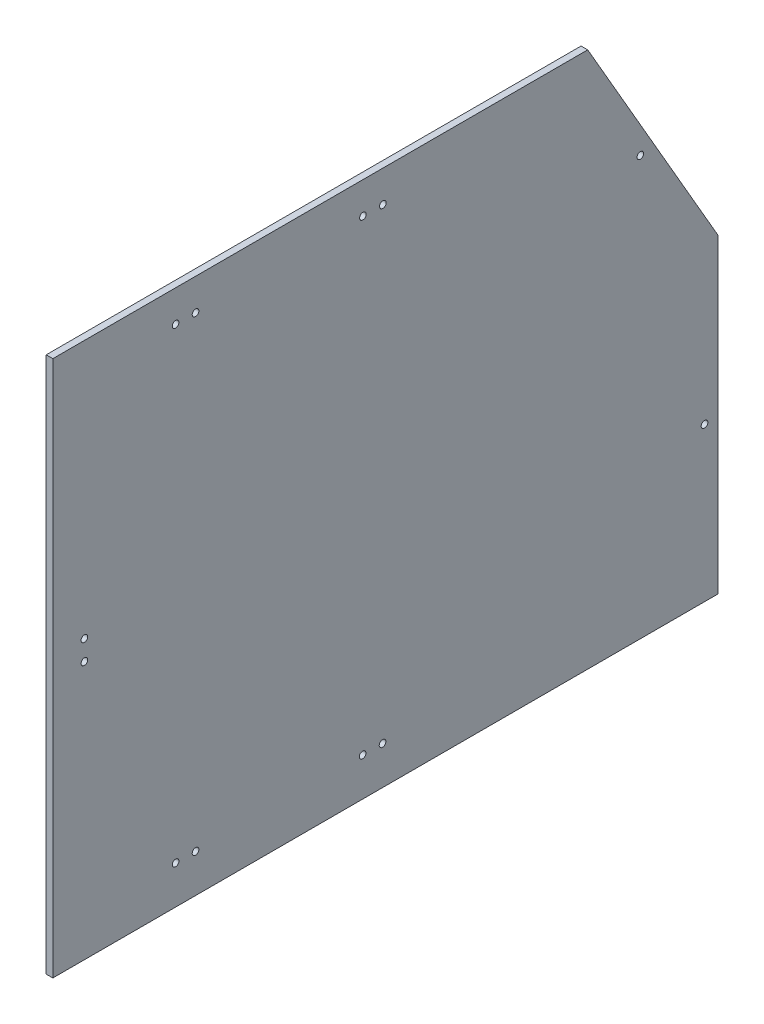
ISO-10303-21;
HEADER;
FILE_DESCRIPTION(('STEP AP214'),'2;1');
FILE_NAME('part.step','',(''),(''),'','','');
FILE_SCHEMA(('AUTOMOTIVE_DESIGN { 1 0 10303 214 1 1 1 1 }'));
ENDSEC;
DATA;
#1=APPLICATION_CONTEXT('core data for automotive mechanical design processes');
#2=APPLICATION_PROTOCOL_DEFINITION('international standard','automotive_design',2000,#1);
#3=PRODUCT_CONTEXT('',#1,'mechanical');
#4=PRODUCT('Part','Part','',(#3));
#5=PRODUCT_RELATED_PRODUCT_CATEGORY('part','',(#4));
#6=PRODUCT_DEFINITION_FORMATION('','',#4);
#7=PRODUCT_DEFINITION_CONTEXT('part definition',#1,'design');
#8=PRODUCT_DEFINITION('design','',#6,#7);
#9=PRODUCT_DEFINITION_SHAPE('','',#8);
#10=(LENGTH_UNIT() NAMED_UNIT(*) SI_UNIT(.MILLI.,.METRE.));
#11=(NAMED_UNIT(*) PLANE_ANGLE_UNIT() SI_UNIT($,.RADIAN.));
#12=(NAMED_UNIT(*) SI_UNIT($,.STERADIAN.) SOLID_ANGLE_UNIT());
#13=UNCERTAINTY_MEASURE_WITH_UNIT(LENGTH_MEASURE(1.E-05),#10,'distance_accuracy_value','');
#14=(GEOMETRIC_REPRESENTATION_CONTEXT(3) GLOBAL_UNCERTAINTY_ASSIGNED_CONTEXT((#13)) GLOBAL_UNIT_ASSIGNED_CONTEXT((#10,
#11,#12)) REPRESENTATION_CONTEXT('',''));
#15=CARTESIAN_POINT('',(0.,0.,0.));
#16=DIRECTION('',(0.,0.,1.));
#17=DIRECTION('',(1.,0.,0.));
#18=AXIS2_PLACEMENT_3D('',#15,#16,#17);
#19=CARTESIAN_POINT('',(3.,0.,0.));
#20=DIRECTION('',(1.,0.,0.));
#21=DIRECTION('',(0.,0.,-1.));
#22=AXIS2_PLACEMENT_3D('',#19,#20,#21);
#23=PLANE('',#22);
#24=CARTESIAN_POINT('',(3.,-59.4436564944908,-80.7515923566879));
#25=DIRECTION('',(1.,0.,0.));
#26=DIRECTION('',(0.,0.,-1.));
#27=AXIS2_PLACEMENT_3D('',#24,#25,#26);
#28=CIRCLE('',#27,1.49999999999994);
#29=CARTESIAN_POINT('',(3.,-59.4436564944908,-82.2515923566879));
#30=VERTEX_POINT('',#29);
#31=EDGE_CURVE('E184',#30,#30,#28,.T.);
#32=ORIENTED_EDGE('',*,*,#31,.F.);
#33=EDGE_LOOP('',(#32));
#34=FACE_BOUND('',#33,.T.);
#35=CARTESIAN_POINT('',(3.,60.0413435055093,-51.8039152110818));
#36=DIRECTION('',(1.,0.,0.));
#37=DIRECTION('',(0.,0.,-1.));
#38=AXIS2_PLACEMENT_3D('',#35,#36,#37);
#39=CIRCLE('',#38,1.49999999999994);
#40=CARTESIAN_POINT('',(3.,60.0413435055093,-53.3039152110817));
#41=VERTEX_POINT('',#40);
#42=EDGE_CURVE('E192',#41,#41,#39,.T.);
#43=ORIENTED_EDGE('',*,*,#42,.F.);
#44=EDGE_LOOP('',(#43));
#45=FACE_BOUND('',#44,.T.);
#46=CARTESIAN_POINT('',(3.,-3.30480891719709,198.995456466428));
#47=DIRECTION('',(1.,0.,0.));
#48=DIRECTION('',(0.,0.,-1.));
#49=AXIS2_PLACEMENT_3D('',#46,#47,#48);
#50=CIRCLE('',#49,1.49999999999994);
#51=CARTESIAN_POINT('',(3.,-3.30480891719709,197.495456466428));
#52=VERTEX_POINT('',#51);
#53=EDGE_CURVE('E203',#52,#52,#50,.T.);
#54=ORIENTED_EDGE('',*,*,#53,.F.);
#55=EDGE_LOOP('',(#54));
#56=FACE_BOUND('',#55,.T.);
#57=CARTESIAN_POINT('',(3.,98.9272399059343,157.867084277006));
#58=DIRECTION('',(1.,0.,0.));
#59=DIRECTION('',(0.,0.,-1.));
#60=AXIS2_PLACEMENT_3D('',#57,#58,#59);
#61=CIRCLE('',#60,1.49999999999997);
#62=CARTESIAN_POINT('',(3.,98.9272399059343,156.367084277006));
#63=VERTEX_POINT('',#62);
#64=EDGE_CURVE('E213',#63,#63,#61,.T.);
#65=ORIENTED_EDGE('',*,*,#64,.F.);
#66=EDGE_LOOP('',(#65));
#67=FACE_BOUND('',#66,.T.);
#68=CARTESIAN_POINT('',(3.,98.9272399059346,148.867084277006));
#69=DIRECTION('',(1.,0.,0.));
#70=DIRECTION('',(0.,0.,-1.));
#71=AXIS2_PLACEMENT_3D('',#68,#69,#70);
#72=CIRCLE('',#71,1.50000000000009);
#73=CARTESIAN_POINT('',(3.,98.9272399059346,147.367084277006));
#74=VERTEX_POINT('',#73);
#75=EDGE_CURVE('E209',#74,#74,#72,.T.);
#76=ORIENTED_EDGE('',*,*,#75,.F.);
#77=EDGE_LOOP('',(#76));
#78=FACE_BOUND('',#77,.T.);
#79=CARTESIAN_POINT('',(3.,98.9272399059301,73.3548674119187));
#80=DIRECTION('',(1.,0.,0.));
#81=DIRECTION('',(0.,0.,-1.));
#82=AXIS2_PLACEMENT_3D('',#79,#80,#81);
#83=CIRCLE('',#82,1.49999999999995);
#84=CARTESIAN_POINT('',(3.,98.9272399059301,71.8548674119187));
#85=VERTEX_POINT('',#84);
#86=EDGE_CURVE('E204',#85,#85,#83,.T.);
#87=ORIENTED_EDGE('',*,*,#86,.F.);
#88=EDGE_LOOP('',(#87));
#89=FACE_BOUND('',#88,.T.);
#90=CARTESIAN_POINT('',(3.,98.9272399059301,64.3548674119187));
#91=DIRECTION('',(1.,0.,0.));
#92=DIRECTION('',(0.,0.,-1.));
#93=AXIS2_PLACEMENT_3D('',#90,#91,#92);
#94=CIRCLE('',#93,1.49999999999995);
#95=CARTESIAN_POINT('',(3.,98.9272399059301,62.8548674119187));
#96=VERTEX_POINT('',#95);
#97=EDGE_CURVE('E208',#96,#96,#94,.T.);
#98=ORIENTED_EDGE('',*,*,#97,.F.);
#99=EDGE_LOOP('',(#98));
#100=FACE_BOUND('',#99,.T.);
#101=CARTESIAN_POINT('',(3.,-111.536857740313,148.867084277005));
#102=DIRECTION('',(1.,0.,0.));
#103=DIRECTION('',(0.,0.,-1.));
#104=AXIS2_PLACEMENT_3D('',#101,#102,#103);
#105=CIRCLE('',#104,1.49999999999997);
#106=CARTESIAN_POINT('',(3.,-111.536857740313,147.367084277005));
#107=VERTEX_POINT('',#106);
#108=EDGE_CURVE('E220',#107,#107,#105,.F.);
#109=ORIENTED_EDGE('',*,*,#108,.T.);
#110=EDGE_LOOP('',(#109));
#111=FACE_BOUND('',#110,.T.);
#112=DIRECTION('',(0.,0.,1.));
#113=VECTOR('',#112,1.);
#114=CARTESIAN_POINT('',(3.,113.180191082803,-28.0523904881823));
#115=LINE('',#114,#113);
#116=CARTESIAN_POINT('',(3.,113.180191082803,-28.0523904881823));
#117=VERTEX_POINT('',#116);
#118=CARTESIAN_POINT('',(3.,113.180191082803,213.248407643312));
#119=VERTEX_POINT('',#118);
#120=EDGE_CURVE('E135',#117,#119,#115,.T.);
#121=ORIENTED_EDGE('',*,*,#120,.T.);
#122=DIRECTION('',(0.,-1.,0.));
#123=VECTOR('',#122,1.);
#124=CARTESIAN_POINT('',(3.,113.180191082803,213.248407643312));
#125=LINE('',#124,#123);
#126=CARTESIAN_POINT('',(3.,-128.789808917197,213.248407643312));
#127=VERTEX_POINT('',#126);
#128=EDGE_CURVE('E93',#119,#127,#125,.T.);
#129=ORIENTED_EDGE('',*,*,#128,.T.);
#130=DIRECTION('',(0.,0.,-1.));
#131=VECTOR('',#130,1.);
#132=CARTESIAN_POINT('',(3.,-128.789808917197,213.248407643312));
#133=LINE('',#132,#131);
#134=CARTESIAN_POINT('',(3.,-128.789808917197,-86.751592356688));
#135=VERTEX_POINT('',#134);
#136=EDGE_CURVE('E97',#127,#135,#133,.T.);
#137=ORIENTED_EDGE('',*,*,#136,.T.);
#138=DIRECTION('',(0.,1.,0.));
#139=VECTOR('',#138,1.);
#140=CARTESIAN_POINT('',(3.,-128.789808917197,-86.751592356688));
#141=LINE('',#140,#139);
#142=CARTESIAN_POINT('',(3.,11.5101910828025,-86.751592356688));
#143=VERTEX_POINT('',#142);
#144=EDGE_CURVE('E101',#135,#143,#141,.T.);
#145=ORIENTED_EDGE('',*,*,#144,.T.);
#146=DIRECTION('',(0.,0.866025403784452,0.499999999999977));
#147=VECTOR('',#146,1.);
#148=CARTESIAN_POINT('',(3.,11.5101910828025,-86.751592356688));
#149=LINE('',#148,#147);
#150=EDGE_CURVE('E59',#143,#117,#149,.T.);
#151=ORIENTED_EDGE('',*,*,#150,.T.);
#152=EDGE_LOOP('',(#121,#129,#137,#145,#151));
#153=FACE_BOUND('',#152,.T.);
#154=CARTESIAN_POINT('',(3.,-111.536857740313,157.867084277005));
#155=DIRECTION('',(1.,0.,0.));
#156=DIRECTION('',(0.,0.,-1.));
#157=AXIS2_PLACEMENT_3D('',#154,#155,#156);
#158=CIRCLE('',#157,1.49999999999997);
#159=CARTESIAN_POINT('',(3.,-111.536857740313,156.367084277005));
#160=VERTEX_POINT('',#159);
#161=EDGE_CURVE('E147',#160,#160,#158,.T.);
#162=ORIENTED_EDGE('',*,*,#161,.F.);
#163=EDGE_LOOP('',(#162));
#164=FACE_BOUND('',#163,.T.);
#165=CARTESIAN_POINT('',(3.,-12.3048089171972,198.995456466428));
#166=DIRECTION('',(1.,0.,0.));
#167=DIRECTION('',(0.,0.,-1.));
#168=AXIS2_PLACEMENT_3D('',#165,#166,#167);
#169=CIRCLE('',#168,1.49999999999994);
#170=CARTESIAN_POINT('',(3.,-12.3048089171972,197.495456466428));
#171=VERTEX_POINT('',#170);
#172=EDGE_CURVE('E190',#171,#171,#169,.F.);
#173=ORIENTED_EDGE('',*,*,#172,.T.);
#174=EDGE_LOOP('',(#173));
#175=FACE_BOUND('',#174,.T.);
#176=CARTESIAN_POINT('',(3.,-111.536857740313,73.5022075014292));
#177=DIRECTION('',(1.,0.,0.));
#178=DIRECTION('',(0.,0.,-1.));
#179=AXIS2_PLACEMENT_3D('',#176,#177,#178);
#180=CIRCLE('',#179,1.49999999999997);
#181=CARTESIAN_POINT('',(3.,-111.536857740313,72.0022075014292));
#182=VERTEX_POINT('',#181);
#183=EDGE_CURVE('E224',#182,#182,#180,.T.);
#184=ORIENTED_EDGE('',*,*,#183,.F.);
#185=EDGE_LOOP('',(#184));
#186=FACE_BOUND('',#185,.T.);
#187=CARTESIAN_POINT('',(3.,-111.536857740313,64.502207501429));
#188=DIRECTION('',(1.,0.,0.));
#189=DIRECTION('',(0.,0.,-1.));
#190=AXIS2_PLACEMENT_3D('',#187,#188,#189);
#191=CIRCLE('',#190,1.49999999999997);
#192=CARTESIAN_POINT('',(3.,-111.536857740313,63.0022075014291));
#193=VERTEX_POINT('',#192);
#194=EDGE_CURVE('E228',#193,#193,#191,.F.);
#195=ORIENTED_EDGE('',*,*,#194,.T.);
#196=EDGE_LOOP('',(#195));
#197=FACE_BOUND('',#196,.T.);
#198=ADVANCED_FACE('F39',(#34,#45,#56,#67,#78,#89,#100,#111,#153,#164,#175,#186,#197),#23,.T.);
#199=CARTESIAN_POINT('',(0.,0.,0.));
#200=DIRECTION('',(1.,0.,0.));
#201=DIRECTION('',(0.,0.,-1.));
#202=AXIS2_PLACEMENT_3D('',#199,#200,#201);
#203=PLANE('',#202);
#204=CARTESIAN_POINT('',(0.,-59.4436564944908,-80.7515923566879));
#205=DIRECTION('',(1.,0.,0.));
#206=DIRECTION('',(0.,0.,-1.));
#207=AXIS2_PLACEMENT_3D('',#204,#205,#206);
#208=CIRCLE('',#207,1.49999999999994);
#209=CARTESIAN_POINT('',(0.,-59.4436564944908,-82.2515923566879));
#210=VERTEX_POINT('',#209);
#211=EDGE_CURVE('E43',#210,#210,#208,.T.);
#212=ORIENTED_EDGE('',*,*,#211,.T.);
#213=EDGE_LOOP('',(#212));
#214=FACE_BOUND('',#213,.T.);
#215=CARTESIAN_POINT('',(0.,60.0413435055093,-51.8039152110818));
#216=DIRECTION('',(1.,0.,0.));
#217=DIRECTION('',(0.,0.,-1.));
#218=AXIS2_PLACEMENT_3D('',#215,#216,#217);
#219=CIRCLE('',#218,1.49999999999994);
#220=CARTESIAN_POINT('',(0.,60.0413435055093,-53.3039152110817));
#221=VERTEX_POINT('',#220);
#222=EDGE_CURVE('E181',#221,#221,#219,.T.);
#223=ORIENTED_EDGE('',*,*,#222,.T.);
#224=EDGE_LOOP('',(#223));
#225=FACE_BOUND('',#224,.T.);
#226=CARTESIAN_POINT('',(0.,-3.30480891719709,198.995456466428));
#227=DIRECTION('',(1.,0.,0.));
#228=DIRECTION('',(0.,0.,-1.));
#229=AXIS2_PLACEMENT_3D('',#226,#227,#228);
#230=CIRCLE('',#229,1.49999999999994);
#231=CARTESIAN_POINT('',(0.,-3.30480891719709,197.495456466428));
#232=VERTEX_POINT('',#231);
#233=EDGE_CURVE('E126',#232,#232,#230,.T.);
#234=ORIENTED_EDGE('',*,*,#233,.T.);
#235=EDGE_LOOP('',(#234));
#236=FACE_BOUND('',#235,.T.);
#237=CARTESIAN_POINT('',(0.,98.9272399059343,157.867084277006));
#238=DIRECTION('',(1.,0.,0.));
#239=DIRECTION('',(0.,0.,-1.));
#240=AXIS2_PLACEMENT_3D('',#237,#238,#239);
#241=CIRCLE('',#240,1.49999999999997);
#242=CARTESIAN_POINT('',(0.,98.9272399059343,156.367084277006));
#243=VERTEX_POINT('',#242);
#244=EDGE_CURVE('E175',#243,#243,#241,.T.);
#245=ORIENTED_EDGE('',*,*,#244,.T.);
#246=EDGE_LOOP('',(#245));
#247=FACE_BOUND('',#246,.T.);
#248=CARTESIAN_POINT('',(0.,98.9272399059346,148.867084277006));
#249=DIRECTION('',(1.,0.,0.));
#250=DIRECTION('',(0.,0.,-1.));
#251=AXIS2_PLACEMENT_3D('',#248,#249,#250);
#252=CIRCLE('',#251,1.50000000000009);
#253=CARTESIAN_POINT('',(0.,98.9272399059346,147.367084277006));
#254=VERTEX_POINT('',#253);
#255=EDGE_CURVE('E171',#254,#254,#252,.T.);
#256=ORIENTED_EDGE('',*,*,#255,.T.);
#257=EDGE_LOOP('',(#256));
#258=FACE_BOUND('',#257,.T.);
#259=CARTESIAN_POINT('',(0.,98.9272399059301,73.3548674119187));
#260=DIRECTION('',(1.,0.,0.));
#261=DIRECTION('',(0.,0.,-1.));
#262=AXIS2_PLACEMENT_3D('',#259,#260,#261);
#263=CIRCLE('',#262,1.49999999999995);
#264=CARTESIAN_POINT('',(0.,98.9272399059301,71.8548674119187));
#265=VERTEX_POINT('',#264);
#266=EDGE_CURVE('E167',#265,#265,#263,.T.);
#267=ORIENTED_EDGE('',*,*,#266,.T.);
#268=EDGE_LOOP('',(#267));
#269=FACE_BOUND('',#268,.T.);
#270=CARTESIAN_POINT('',(0.,98.9272399059301,64.3548674119187));
#271=DIRECTION('',(1.,0.,0.));
#272=DIRECTION('',(0.,0.,-1.));
#273=AXIS2_PLACEMENT_3D('',#270,#271,#272);
#274=CIRCLE('',#273,1.49999999999995);
#275=CARTESIAN_POINT('',(0.,98.9272399059301,62.8548674119187));
#276=VERTEX_POINT('',#275);
#277=EDGE_CURVE('E163',#276,#276,#274,.T.);
#278=ORIENTED_EDGE('',*,*,#277,.T.);
#279=EDGE_LOOP('',(#278));
#280=FACE_BOUND('',#279,.T.);
#281=CARTESIAN_POINT('',(0.,-111.536857740313,73.5022075014292));
#282=DIRECTION('',(1.,0.,0.));
#283=DIRECTION('',(0.,0.,-1.));
#284=AXIS2_PLACEMENT_3D('',#281,#282,#283);
#285=CIRCLE('',#284,1.49999999999997);
#286=CARTESIAN_POINT('',(0.,-111.536857740313,72.0022075014292));
#287=VERTEX_POINT('',#286);
#288=EDGE_CURVE('E155',#287,#287,#285,.T.);
#289=ORIENTED_EDGE('',*,*,#288,.T.);
#290=EDGE_LOOP('',(#289));
#291=FACE_BOUND('',#290,.T.);
#292=CARTESIAN_POINT('',(0.,-111.536857740313,157.867084277005));
#293=DIRECTION('',(1.,0.,0.));
#294=DIRECTION('',(0.,0.,-1.));
#295=AXIS2_PLACEMENT_3D('',#292,#293,#294);
#296=CIRCLE('',#295,1.49999999999997);
#297=CARTESIAN_POINT('',(0.,-111.536857740313,156.367084277005));
#298=VERTEX_POINT('',#297);
#299=EDGE_CURVE('E142',#298,#298,#296,.T.);
#300=ORIENTED_EDGE('',*,*,#299,.T.);
#301=EDGE_LOOP('',(#300));
#302=FACE_BOUND('',#301,.T.);
#303=DIRECTION('',(0.,0.,1.));
#304=VECTOR('',#303,1.);
#305=CARTESIAN_POINT('',(0.,113.180191082803,-28.0523904881823));
#306=LINE('',#305,#304);
#307=CARTESIAN_POINT('',(0.,113.180191082803,-28.0523904881823));
#308=VERTEX_POINT('',#307);
#309=CARTESIAN_POINT('',(0.,113.180191082803,213.248407643312));
#310=VERTEX_POINT('',#309);
#311=EDGE_CURVE('E121',#308,#310,#306,.T.);
#312=ORIENTED_EDGE('',*,*,#311,.F.);
#313=DIRECTION('',(0.,0.866025403784452,0.499999999999977));
#314=VECTOR('',#313,1.);
#315=CARTESIAN_POINT('',(0.,11.5101910828025,-86.751592356688));
#316=LINE('',#315,#314);
#317=CARTESIAN_POINT('',(0.,11.5101910828025,-86.751592356688));
#318=VERTEX_POINT('',#317);
#319=EDGE_CURVE('E85',#318,#308,#316,.T.);
#320=ORIENTED_EDGE('',*,*,#319,.F.);
#321=DIRECTION('',(0.,1.,0.));
#322=VECTOR('',#321,1.);
#323=CARTESIAN_POINT('',(0.,-128.789808917197,-86.751592356688));
#324=LINE('',#323,#322);
#325=CARTESIAN_POINT('',(0.,-128.789808917197,-86.751592356688));
#326=VERTEX_POINT('',#325);
#327=EDGE_CURVE('E79',#326,#318,#324,.T.);
#328=ORIENTED_EDGE('',*,*,#327,.F.);
#329=DIRECTION('',(0.,0.,-1.));
#330=VECTOR('',#329,1.);
#331=CARTESIAN_POINT('',(0.,-128.789808917197,213.248407643312));
#332=LINE('',#331,#330);
#333=CARTESIAN_POINT('',(0.,-128.789808917197,213.248407643312));
#334=VERTEX_POINT('',#333);
#335=EDGE_CURVE('E109',#334,#326,#332,.T.);
#336=ORIENTED_EDGE('',*,*,#335,.F.);
#337=DIRECTION('',(0.,-1.,0.));
#338=VECTOR('',#337,1.);
#339=CARTESIAN_POINT('',(0.,113.180191082803,213.248407643312));
#340=LINE('',#339,#338);
#341=EDGE_CURVE('E125',#310,#334,#340,.T.);
#342=ORIENTED_EDGE('',*,*,#341,.F.);
#343=EDGE_LOOP('',(#312,#320,#328,#336,#342));
#344=FACE_BOUND('',#343,.T.);
#345=CARTESIAN_POINT('',(0.,-12.3048089171972,198.995456466428));
#346=DIRECTION('',(1.,0.,0.));
#347=DIRECTION('',(0.,0.,-1.));
#348=AXIS2_PLACEMENT_3D('',#345,#346,#347);
#349=CIRCLE('',#348,1.49999999999994);
#350=CARTESIAN_POINT('',(0.,-12.3048089171972,197.495456466428));
#351=VERTEX_POINT('',#350);
#352=EDGE_CURVE('E146',#351,#351,#349,.F.);
#353=ORIENTED_EDGE('',*,*,#352,.F.);
#354=EDGE_LOOP('',(#353));
#355=FACE_BOUND('',#354,.T.);
#356=CARTESIAN_POINT('',(0.,-111.536857740313,148.867084277005));
#357=DIRECTION('',(1.,0.,0.));
#358=DIRECTION('',(0.,0.,-1.));
#359=AXIS2_PLACEMENT_3D('',#356,#357,#358);
#360=CIRCLE('',#359,1.49999999999997);
#361=CARTESIAN_POINT('',(0.,-111.536857740313,147.367084277005));
#362=VERTEX_POINT('',#361);
#363=EDGE_CURVE('E151',#362,#362,#360,.F.);
#364=ORIENTED_EDGE('',*,*,#363,.F.);
#365=EDGE_LOOP('',(#364));
#366=FACE_BOUND('',#365,.T.);
#367=CARTESIAN_POINT('',(0.,-111.536857740313,64.502207501429));
#368=DIRECTION('',(1.,0.,0.));
#369=DIRECTION('',(0.,0.,-1.));
#370=AXIS2_PLACEMENT_3D('',#367,#368,#369);
#371=CIRCLE('',#370,1.49999999999997);
#372=CARTESIAN_POINT('',(0.,-111.536857740313,63.0022075014291));
#373=VERTEX_POINT('',#372);
#374=EDGE_CURVE('E159',#373,#373,#371,.F.);
#375=ORIENTED_EDGE('',*,*,#374,.F.);
#376=EDGE_LOOP('',(#375));
#377=FACE_BOUND('',#376,.T.);
#378=ADVANCED_FACE('F246',(#214,#225,#236,#247,#258,#269,#280,#291,#302,#344,#355,#366,#377),
#203,.F.);
#379=CARTESIAN_POINT('',(3.,113.180191082803,-28.0523904881823));
#380=DIRECTION('',(0.,-1.,0.));
#381=DIRECTION('',(0.,0.,-1.));
#382=AXIS2_PLACEMENT_3D('',#379,#380,#381);
#383=PLANE('',#382);
#384=ORIENTED_EDGE('',*,*,#311,.T.);
#385=DIRECTION('',(-1.,0.,0.));
#386=VECTOR('',#385,1.);
#387=CARTESIAN_POINT('',(3.,113.180191082803,213.248407643312));
#388=LINE('',#387,#386);
#389=EDGE_CURVE('E11',#119,#310,#388,.T.);
#390=ORIENTED_EDGE('',*,*,#389,.F.);
#391=ORIENTED_EDGE('',*,*,#120,.F.);
#392=DIRECTION('',(-1.,0.,0.));
#393=VECTOR('',#392,1.);
#394=CARTESIAN_POINT('',(3.,113.180191082803,-28.0523904881823));
#395=LINE('',#394,#393);
#396=EDGE_CURVE('E117',#117,#308,#395,.T.);
#397=ORIENTED_EDGE('',*,*,#396,.T.);
#398=EDGE_LOOP('',(#384,#390,#391,#397));
#399=FACE_BOUND('',#398,.T.);
#400=ADVANCED_FACE('F41',(#399),#383,.F.);
#401=CARTESIAN_POINT('',(3.,113.180191082803,213.248407643312));
#402=DIRECTION('',(0.,0.,-1.));
#403=DIRECTION('',(-1.,0.,0.));
#404=AXIS2_PLACEMENT_3D('',#401,#402,#403);
#405=PLANE('',#404);
#406=ORIENTED_EDGE('',*,*,#341,.T.);
#407=DIRECTION('',(-1.,0.,0.));
#408=VECTOR('',#407,1.);
#409=CARTESIAN_POINT('',(3.,-128.789808917197,213.248407643312));
#410=LINE('',#409,#408);
#411=EDGE_CURVE('E50',#127,#334,#410,.T.);
#412=ORIENTED_EDGE('',*,*,#411,.F.);
#413=ORIENTED_EDGE('',*,*,#128,.F.);
#414=ORIENTED_EDGE('',*,*,#389,.T.);
#415=EDGE_LOOP('',(#406,#412,#413,#414));
#416=FACE_BOUND('',#415,.T.);
#417=ADVANCED_FACE('F244',(#416),#405,.F.);
#418=CARTESIAN_POINT('',(3.,-128.789808917197,213.248407643312));
#419=DIRECTION('',(0.,1.,0.));
#420=DIRECTION('',(0.,0.,1.));
#421=AXIS2_PLACEMENT_3D('',#418,#419,#420);
#422=PLANE('',#421);
#423=ORIENTED_EDGE('',*,*,#335,.T.);
#424=DIRECTION('',(-1.,0.,0.));
#425=VECTOR('',#424,1.);
#426=CARTESIAN_POINT('',(3.,-128.789808917197,-86.751592356688));
#427=LINE('',#426,#425);
#428=EDGE_CURVE('E106',#135,#326,#427,.T.);
#429=ORIENTED_EDGE('',*,*,#428,.F.);
#430=ORIENTED_EDGE('',*,*,#136,.F.);
#431=ORIENTED_EDGE('',*,*,#411,.T.);
#432=EDGE_LOOP('',(#423,#429,#430,#431));
#433=FACE_BOUND('',#432,.T.);
#434=ADVANCED_FACE('F107',(#433),#422,.F.);
#435=CARTESIAN_POINT('',(3.,-128.789808917197,-86.751592356688));
#436=DIRECTION('',(0.,0.,1.));
#437=DIRECTION('',(1.,0.,0.));
#438=AXIS2_PLACEMENT_3D('',#435,#436,#437);
#439=PLANE('',#438);
#440=ORIENTED_EDGE('',*,*,#327,.T.);
#441=DIRECTION('',(-1.,0.,0.));
#442=VECTOR('',#441,1.);
#443=CARTESIAN_POINT('',(3.,11.5101910828025,-86.751592356688));
#444=LINE('',#443,#442);
#445=EDGE_CURVE('E111',#143,#318,#444,.T.);
#446=ORIENTED_EDGE('',*,*,#445,.F.);
#447=ORIENTED_EDGE('',*,*,#144,.F.);
#448=ORIENTED_EDGE('',*,*,#428,.T.);
#449=EDGE_LOOP('',(#440,#446,#447,#448));
#450=FACE_BOUND('',#449,.T.);
#451=ADVANCED_FACE('F113',(#450),#439,.F.);
#452=CARTESIAN_POINT('',(3.,11.5101910828025,-86.751592356688));
#453=DIRECTION('',(0.,-0.499999999999977,0.866025403784452));
#454=DIRECTION('',(0.,-0.866025403784452,-0.499999999999977));
#455=AXIS2_PLACEMENT_3D('',#452,#453,#454);
#456=PLANE('',#455);
#457=ORIENTED_EDGE('',*,*,#319,.T.);
#458=ORIENTED_EDGE('',*,*,#396,.F.);
#459=ORIENTED_EDGE('',*,*,#150,.F.);
#460=ORIENTED_EDGE('',*,*,#445,.T.);
#461=EDGE_LOOP('',(#457,#458,#459,#460));
#462=FACE_BOUND('',#461,.T.);
#463=ADVANCED_FACE('F283',(#462),#456,.F.);
#464=CARTESIAN_POINT('',(-7.,-111.536857740313,157.867084277005));
#465=DIRECTION('',(1.,0.,0.));
#466=DIRECTION('',(0.,0.,-1.));
#467=AXIS2_PLACEMENT_3D('',#464,#465,#466);
#468=CYLINDRICAL_SURFACE('',#467,1.49999999999997);
#469=ORIENTED_EDGE('',*,*,#161,.T.);
#470=EDGE_LOOP('',(#469));
#471=FACE_BOUND('',#470,.T.);
#472=ORIENTED_EDGE('',*,*,#299,.F.);
#473=EDGE_LOOP('',(#472));
#474=FACE_BOUND('',#473,.T.);
#475=ADVANCED_FACE('F281',(#471,#474),#468,.F.);
#476=CARTESIAN_POINT('',(-7.,-12.3048089171972,198.995456466428));
#477=DIRECTION('',(1.,0.,0.));
#478=DIRECTION('',(0.,0.,-1.));
#479=AXIS2_PLACEMENT_3D('',#476,#477,#478);
#480=CYLINDRICAL_SURFACE('',#479,1.49999999999994);
#481=ORIENTED_EDGE('',*,*,#172,.F.);
#482=EDGE_LOOP('',(#481));
#483=FACE_BOUND('',#482,.T.);
#484=ORIENTED_EDGE('',*,*,#352,.T.);
#485=EDGE_LOOP('',(#484));
#486=FACE_BOUND('',#485,.T.);
#487=ADVANCED_FACE('F331',(#483,#486),#480,.F.);
#488=CARTESIAN_POINT('',(-7.,-111.536857740313,148.867084277005));
#489=DIRECTION('',(1.,0.,0.));
#490=DIRECTION('',(0.,0.,-1.));
#491=AXIS2_PLACEMENT_3D('',#488,#489,#490);
#492=CYLINDRICAL_SURFACE('',#491,1.49999999999997);
#493=ORIENTED_EDGE('',*,*,#108,.F.);
#494=EDGE_LOOP('',(#493));
#495=FACE_BOUND('',#494,.T.);
#496=ORIENTED_EDGE('',*,*,#363,.T.);
#497=EDGE_LOOP('',(#496));
#498=FACE_BOUND('',#497,.T.);
#499=ADVANCED_FACE('F270',(#495,#498),#492,.F.);
#500=CARTESIAN_POINT('',(-7.,-111.536857740313,73.5022075014292));
#501=DIRECTION('',(1.,0.,0.));
#502=DIRECTION('',(0.,0.,-1.));
#503=AXIS2_PLACEMENT_3D('',#500,#501,#502);
#504=CYLINDRICAL_SURFACE('',#503,1.49999999999997);
#505=ORIENTED_EDGE('',*,*,#183,.T.);
#506=EDGE_LOOP('',(#505));
#507=FACE_BOUND('',#506,.T.);
#508=ORIENTED_EDGE('',*,*,#288,.F.);
#509=EDGE_LOOP('',(#508));
#510=FACE_BOUND('',#509,.T.);
#511=ADVANCED_FACE('F260',(#507,#510),#504,.F.);
#512=CARTESIAN_POINT('',(-7.,-111.536857740313,64.502207501429));
#513=DIRECTION('',(1.,0.,0.));
#514=DIRECTION('',(0.,0.,-1.));
#515=AXIS2_PLACEMENT_3D('',#512,#513,#514);
#516=CYLINDRICAL_SURFACE('',#515,1.49999999999997);
#517=ORIENTED_EDGE('',*,*,#194,.F.);
#518=EDGE_LOOP('',(#517));
#519=FACE_BOUND('',#518,.T.);
#520=ORIENTED_EDGE('',*,*,#374,.T.);
#521=EDGE_LOOP('',(#520));
#522=FACE_BOUND('',#521,.T.);
#523=ADVANCED_FACE('F257',(#519,#522),#516,.F.);
#524=CARTESIAN_POINT('',(-7.,98.9272399059301,64.3548674119187));
#525=DIRECTION('',(1.,0.,0.));
#526=DIRECTION('',(0.,0.,-1.));
#527=AXIS2_PLACEMENT_3D('',#524,#525,#526);
#528=CYLINDRICAL_SURFACE('',#527,1.49999999999995);
#529=ORIENTED_EDGE('',*,*,#97,.T.);
#530=EDGE_LOOP('',(#529));
#531=FACE_BOUND('',#530,.T.);
#532=ORIENTED_EDGE('',*,*,#277,.F.);
#533=EDGE_LOOP('',(#532));
#534=FACE_BOUND('',#533,.T.);
#535=ADVANCED_FACE('F259',(#531,#534),#528,.F.);
#536=CARTESIAN_POINT('',(-7.,98.9272399059301,73.3548674119187));
#537=DIRECTION('',(1.,0.,0.));
#538=DIRECTION('',(0.,0.,-1.));
#539=AXIS2_PLACEMENT_3D('',#536,#537,#538);
#540=CYLINDRICAL_SURFACE('',#539,1.49999999999995);
#541=ORIENTED_EDGE('',*,*,#86,.T.);
#542=EDGE_LOOP('',(#541));
#543=FACE_BOUND('',#542,.T.);
#544=ORIENTED_EDGE('',*,*,#266,.F.);
#545=EDGE_LOOP('',(#544));
#546=FACE_BOUND('',#545,.T.);
#547=ADVANCED_FACE('F267',(#543,#546),#540,.F.);
#548=CARTESIAN_POINT('',(-7.,98.9272399059346,148.867084277006));
#549=DIRECTION('',(1.,0.,0.));
#550=DIRECTION('',(0.,0.,-1.));
#551=AXIS2_PLACEMENT_3D('',#548,#549,#550);
#552=CYLINDRICAL_SURFACE('',#551,1.50000000000009);
#553=ORIENTED_EDGE('',*,*,#75,.T.);
#554=EDGE_LOOP('',(#553));
#555=FACE_BOUND('',#554,.T.);
#556=ORIENTED_EDGE('',*,*,#255,.F.);
#557=EDGE_LOOP('',(#556));
#558=FACE_BOUND('',#557,.T.);
#559=ADVANCED_FACE('F337',(#555,#558),#552,.F.);
#560=CARTESIAN_POINT('',(-7.,98.9272399059343,157.867084277006));
#561=DIRECTION('',(1.,0.,0.));
#562=DIRECTION('',(0.,0.,-1.));
#563=AXIS2_PLACEMENT_3D('',#560,#561,#562);
#564=CYLINDRICAL_SURFACE('',#563,1.49999999999997);
#565=ORIENTED_EDGE('',*,*,#64,.T.);
#566=EDGE_LOOP('',(#565));
#567=FACE_BOUND('',#566,.T.);
#568=ORIENTED_EDGE('',*,*,#244,.F.);
#569=EDGE_LOOP('',(#568));
#570=FACE_BOUND('',#569,.T.);
#571=ADVANCED_FACE('F341',(#567,#570),#564,.F.);
#572=CARTESIAN_POINT('',(-7.,-3.30480891719709,198.995456466428));
#573=DIRECTION('',(1.,0.,0.));
#574=DIRECTION('',(0.,0.,-1.));
#575=AXIS2_PLACEMENT_3D('',#572,#573,#574);
#576=CYLINDRICAL_SURFACE('',#575,1.49999999999994);
#577=ORIENTED_EDGE('',*,*,#53,.T.);
#578=EDGE_LOOP('',(#577));
#579=FACE_BOUND('',#578,.T.);
#580=ORIENTED_EDGE('',*,*,#233,.F.);
#581=EDGE_LOOP('',(#580));
#582=FACE_BOUND('',#581,.T.);
#583=ADVANCED_FACE('F314',(#579,#582),#576,.F.);
#584=CARTESIAN_POINT('',(-7.,60.0413435055093,-51.8039152110818));
#585=DIRECTION('',(1.,0.,0.));
#586=DIRECTION('',(0.,0.,-1.));
#587=AXIS2_PLACEMENT_3D('',#584,#585,#586);
#588=CYLINDRICAL_SURFACE('',#587,1.49999999999994);
#589=ORIENTED_EDGE('',*,*,#42,.T.);
#590=EDGE_LOOP('',(#589));
#591=FACE_BOUND('',#590,.T.);
#592=ORIENTED_EDGE('',*,*,#222,.F.);
#593=EDGE_LOOP('',(#592));
#594=FACE_BOUND('',#593,.T.);
#595=ADVANCED_FACE('F308',(#591,#594),#588,.F.);
#596=CARTESIAN_POINT('',(-7.,-59.4436564944908,-80.7515923566879));
#597=DIRECTION('',(1.,0.,0.));
#598=DIRECTION('',(0.,0.,-1.));
#599=AXIS2_PLACEMENT_3D('',#596,#597,#598);
#600=CYLINDRICAL_SURFACE('',#599,1.49999999999994);
#601=ORIENTED_EDGE('',*,*,#31,.T.);
#602=EDGE_LOOP('',(#601));
#603=FACE_BOUND('',#602,.T.);
#604=ORIENTED_EDGE('',*,*,#211,.F.);
#605=EDGE_LOOP('',(#604));
#606=FACE_BOUND('',#605,.T.);
#607=ADVANCED_FACE('F313',(#603,#606),#600,.F.);
#608=CLOSED_SHELL('',(#198,#378,#400,#417,#434,#451,#463,#475,#487,#499,#511,#523,#535,#547,
#559,#571,#583,#595,#607));
#609=MANIFOLD_SOLID_BREP('B2',#608);
#610=ADVANCED_BREP_SHAPE_REPRESENTATION('',(#18,#609),#14);
#611=SHAPE_DEFINITION_REPRESENTATION(#9,#610);
ENDSEC;
END-ISO-10303-21;
